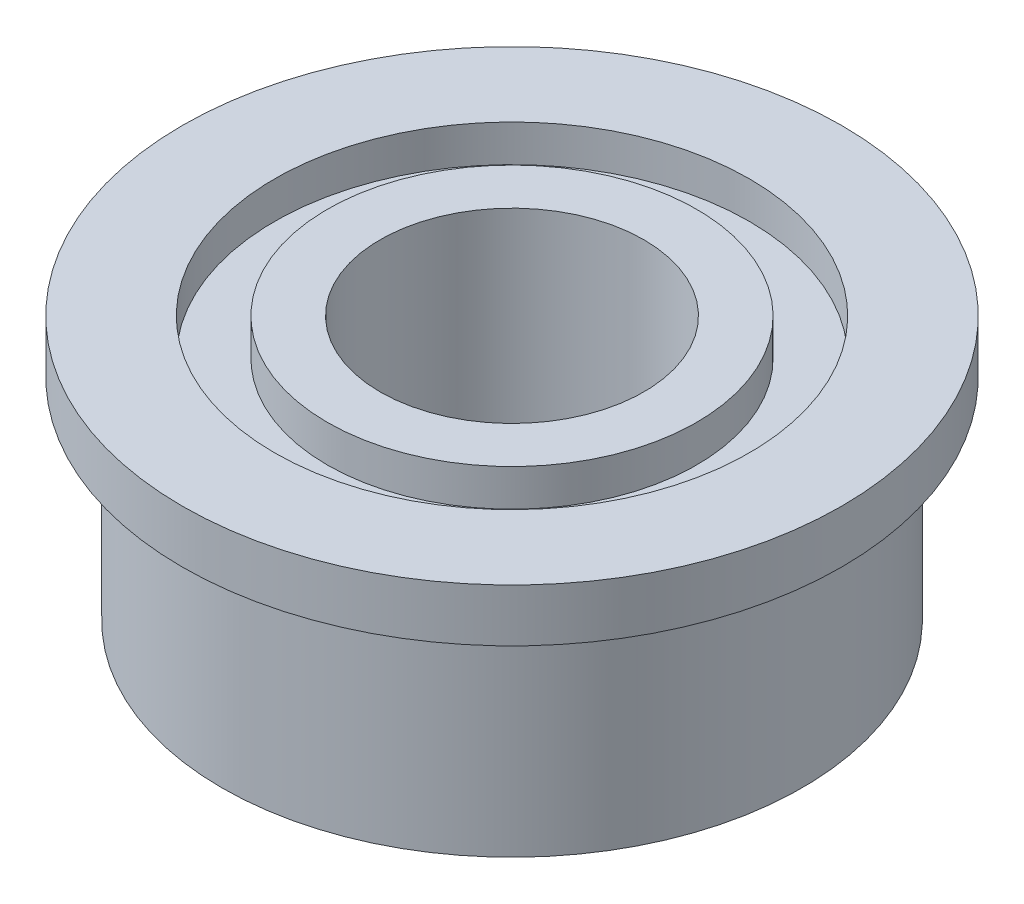
ISO-10303-21;
HEADER;
FILE_DESCRIPTION(('STEP AP214'),'2;1');
FILE_NAME('part.step','',(''),(''),'','','');
FILE_SCHEMA(('AUTOMOTIVE_DESIGN { 1 0 10303 214 1 1 1 1 }'));
ENDSEC;
DATA;
#1=APPLICATION_CONTEXT('core data for automotive mechanical design processes');
#2=APPLICATION_PROTOCOL_DEFINITION('international standard','automotive_design',2000,#1);
#3=PRODUCT_CONTEXT('',#1,'mechanical');
#4=PRODUCT('Part','Part','',(#3));
#5=PRODUCT_RELATED_PRODUCT_CATEGORY('part','',(#4));
#6=PRODUCT_DEFINITION_FORMATION('','',#4);
#7=PRODUCT_DEFINITION_CONTEXT('part definition',#1,'design');
#8=PRODUCT_DEFINITION('design','',#6,#7);
#9=PRODUCT_DEFINITION_SHAPE('','',#8);
#10=(LENGTH_UNIT() NAMED_UNIT(*) SI_UNIT(.MILLI.,.METRE.));
#11=(NAMED_UNIT(*) PLANE_ANGLE_UNIT() SI_UNIT($,.RADIAN.));
#12=(NAMED_UNIT(*) SI_UNIT($,.STERADIAN.) SOLID_ANGLE_UNIT());
#13=UNCERTAINTY_MEASURE_WITH_UNIT(LENGTH_MEASURE(1.E-05),#10,'distance_accuracy_value','');
#14=(GEOMETRIC_REPRESENTATION_CONTEXT(3) GLOBAL_UNCERTAINTY_ASSIGNED_CONTEXT((#13)) GLOBAL_UNIT_ASSIGNED_CONTEXT((#10,
#11,#12)) REPRESENTATION_CONTEXT('',''));
#15=CARTESIAN_POINT('',(0.,0.,0.));
#16=DIRECTION('',(0.,0.,1.));
#17=DIRECTION('',(1.,0.,0.));
#18=AXIS2_PLACEMENT_3D('',#15,#16,#17);
#19=CARTESIAN_POINT('',(0.,4.61129603751149,0.));
#20=DIRECTION('',(0.,1.,0.));
#21=DIRECTION('',(0.,0.,1.));
#22=AXIS2_PLACEMENT_3D('',#19,#20,#21);
#23=CYLINDRICAL_SURFACE('',#22,5.5);
#24=CARTESIAN_POINT('',(0.,0.,0.));
#25=DIRECTION('',(0.,1.,0.));
#26=DIRECTION('',(0.,0.,1.));
#27=AXIS2_PLACEMENT_3D('',#24,#25,#26);
#28=CIRCLE('',#27,5.5);
#29=CARTESIAN_POINT('',(0.,0.,5.5));
#30=VERTEX_POINT('',#29);
#31=EDGE_CURVE('E68',#30,#30,#28,.T.);
#32=ORIENTED_EDGE('',*,*,#31,.T.);
#33=EDGE_LOOP('',(#32));
#34=FACE_BOUND('',#33,.T.);
#35=CARTESIAN_POINT('',(0.,4.,0.));
#36=DIRECTION('',(0.,1.,0.));
#37=DIRECTION('',(0.,0.,1.));
#38=AXIS2_PLACEMENT_3D('',#35,#36,#37);
#39=CIRCLE('',#38,5.5);
#40=CARTESIAN_POINT('',(0.,4.,5.5));
#41=VERTEX_POINT('',#40);
#42=EDGE_CURVE('E10',#41,#41,#39,.T.);
#43=ORIENTED_EDGE('',*,*,#42,.F.);
#44=EDGE_LOOP('',(#43));
#45=FACE_BOUND('',#44,.T.);
#46=ADVANCED_FACE('F39',(#34,#45),#23,.T.);
#47=CARTESIAN_POINT('',(3.5,5.,0.));
#48=DIRECTION('',(0.,-1.,0.));
#49=DIRECTION('',(0.,0.,-1.));
#50=AXIS2_PLACEMENT_3D('',#47,#48,#49);
#51=PLANE('',#50);
#52=CARTESIAN_POINT('',(0.,5.,0.));
#53=DIRECTION('',(0.,1.,0.));
#54=DIRECTION('',(0.,0.,1.));
#55=AXIS2_PLACEMENT_3D('',#52,#53,#54);
#56=CIRCLE('',#55,2.5);
#57=CARTESIAN_POINT('',(0.,5.,2.5));
#58=VERTEX_POINT('',#57);
#59=EDGE_CURVE('E46',#58,#58,#56,.T.);
#60=ORIENTED_EDGE('',*,*,#59,.F.);
#61=EDGE_LOOP('',(#60));
#62=FACE_BOUND('',#61,.T.);
#63=CARTESIAN_POINT('',(0.,5.,0.));
#64=DIRECTION('',(0.,1.,0.));
#65=DIRECTION('',(0.,0.,1.));
#66=AXIS2_PLACEMENT_3D('',#63,#64,#65);
#67=CIRCLE('',#66,3.5);
#68=CARTESIAN_POINT('',(0.,5.,3.5));
#69=VERTEX_POINT('',#68);
#70=EDGE_CURVE('E80',#69,#69,#67,.T.);
#71=ORIENTED_EDGE('',*,*,#70,.T.);
#72=EDGE_LOOP('',(#71));
#73=FACE_BOUND('',#72,.T.);
#74=ADVANCED_FACE('F41',(#62,#73),#51,.F.);
#75=CARTESIAN_POINT('',(0.,4.61129603751149,0.));
#76=DIRECTION('',(0.,1.,0.));
#77=DIRECTION('',(0.,0.,1.));
#78=AXIS2_PLACEMENT_3D('',#75,#76,#77);
#79=CYLINDRICAL_SURFACE('',#78,2.5);
#80=CARTESIAN_POINT('',(0.,0.,0.));
#81=DIRECTION('',(0.,1.,0.));
#82=DIRECTION('',(0.,0.,1.));
#83=AXIS2_PLACEMENT_3D('',#80,#81,#82);
#84=CIRCLE('',#83,2.5);
#85=CARTESIAN_POINT('',(0.,0.,2.5));
#86=VERTEX_POINT('',#85);
#87=EDGE_CURVE('E50',#86,#86,#84,.T.);
#88=ORIENTED_EDGE('',*,*,#87,.F.);
#89=EDGE_LOOP('',(#88));
#90=FACE_BOUND('',#89,.T.);
#91=ORIENTED_EDGE('',*,*,#59,.T.);
#92=EDGE_LOOP('',(#91));
#93=FACE_BOUND('',#92,.T.);
#94=ADVANCED_FACE('F107',(#90,#93),#79,.F.);
#95=CARTESIAN_POINT('',(2.5,0.,0.));
#96=DIRECTION('',(0.,1.,0.));
#97=DIRECTION('',(0.,0.,1.));
#98=AXIS2_PLACEMENT_3D('',#95,#96,#97);
#99=PLANE('',#98);
#100=CARTESIAN_POINT('',(0.,0.,0.));
#101=DIRECTION('',(0.,1.,0.));
#102=DIRECTION('',(0.,0.,1.));
#103=AXIS2_PLACEMENT_3D('',#100,#101,#102);
#104=CIRCLE('',#103,3.5);
#105=CARTESIAN_POINT('',(0.,0.,3.5));
#106=VERTEX_POINT('',#105);
#107=EDGE_CURVE('E54',#106,#106,#104,.T.);
#108=ORIENTED_EDGE('',*,*,#107,.F.);
#109=EDGE_LOOP('',(#108));
#110=FACE_BOUND('',#109,.T.);
#111=ORIENTED_EDGE('',*,*,#87,.T.);
#112=EDGE_LOOP('',(#111));
#113=FACE_BOUND('',#112,.T.);
#114=ADVANCED_FACE('F129',(#110,#113),#99,.F.);
#115=CARTESIAN_POINT('',(0.,4.61129603751149,0.));
#116=DIRECTION('',(0.,1.,0.));
#117=DIRECTION('',(0.,0.,1.));
#118=AXIS2_PLACEMENT_3D('',#115,#116,#117);
#119=CYLINDRICAL_SURFACE('',#118,3.5);
#120=CARTESIAN_POINT('',(0.,0.7,0.));
#121=DIRECTION('',(0.,1.,0.));
#122=DIRECTION('',(0.,0.,1.));
#123=AXIS2_PLACEMENT_3D('',#120,#121,#122);
#124=CIRCLE('',#123,3.5);
#125=CARTESIAN_POINT('',(0.,0.7,3.5));
#126=VERTEX_POINT('',#125);
#127=EDGE_CURVE('E59',#126,#126,#124,.T.);
#128=ORIENTED_EDGE('',*,*,#127,.F.);
#129=EDGE_LOOP('',(#128));
#130=FACE_BOUND('',#129,.T.);
#131=ORIENTED_EDGE('',*,*,#107,.T.);
#132=EDGE_LOOP('',(#131));
#133=FACE_BOUND('',#132,.T.);
#134=ADVANCED_FACE('F125',(#130,#133),#119,.T.);
#135=CARTESIAN_POINT('',(3.5,0.7,0.));
#136=DIRECTION('',(0.,1.,0.));
#137=DIRECTION('',(0.,0.,1.));
#138=AXIS2_PLACEMENT_3D('',#135,#136,#137);
#139=PLANE('',#138);
#140=CARTESIAN_POINT('',(0.,0.7,0.));
#141=DIRECTION('',(0.,1.,0.));
#142=DIRECTION('',(0.,0.,1.));
#143=AXIS2_PLACEMENT_3D('',#140,#141,#142);
#144=CIRCLE('',#143,4.5);
#145=CARTESIAN_POINT('',(0.,0.7,4.5));
#146=VERTEX_POINT('',#145);
#147=EDGE_CURVE('E62',#146,#146,#144,.T.);
#148=ORIENTED_EDGE('',*,*,#147,.F.);
#149=EDGE_LOOP('',(#148));
#150=FACE_BOUND('',#149,.T.);
#151=ORIENTED_EDGE('',*,*,#127,.T.);
#152=EDGE_LOOP('',(#151));
#153=FACE_BOUND('',#152,.T.);
#154=ADVANCED_FACE('F121',(#150,#153),#139,.F.);
#155=CARTESIAN_POINT('',(0.,4.61129603751149,0.));
#156=DIRECTION('',(0.,1.,0.));
#157=DIRECTION('',(0.,0.,1.));
#158=AXIS2_PLACEMENT_3D('',#155,#156,#157);
#159=CYLINDRICAL_SURFACE('',#158,4.5);
#160=CARTESIAN_POINT('',(0.,0.,0.));
#161=DIRECTION('',(0.,1.,0.));
#162=DIRECTION('',(0.,0.,1.));
#163=AXIS2_PLACEMENT_3D('',#160,#161,#162);
#164=CIRCLE('',#163,4.5);
#165=CARTESIAN_POINT('',(0.,0.,4.5));
#166=VERTEX_POINT('',#165);
#167=EDGE_CURVE('E65',#166,#166,#164,.T.);
#168=ORIENTED_EDGE('',*,*,#167,.F.);
#169=EDGE_LOOP('',(#168));
#170=FACE_BOUND('',#169,.T.);
#171=ORIENTED_EDGE('',*,*,#147,.T.);
#172=EDGE_LOOP('',(#171));
#173=FACE_BOUND('',#172,.T.);
#174=ADVANCED_FACE('F117',(#170,#173),#159,.F.);
#175=CARTESIAN_POINT('',(4.5,0.,0.));
#176=DIRECTION('',(0.,1.,0.));
#177=DIRECTION('',(0.,0.,1.));
#178=AXIS2_PLACEMENT_3D('',#175,#176,#177);
#179=PLANE('',#178);
#180=ORIENTED_EDGE('',*,*,#31,.F.);
#181=EDGE_LOOP('',(#180));
#182=FACE_BOUND('',#181,.T.);
#183=ORIENTED_EDGE('',*,*,#167,.T.);
#184=EDGE_LOOP('',(#183));
#185=FACE_BOUND('',#184,.T.);
#186=ADVANCED_FACE('F114',(#182,#185),#179,.F.);
#187=CARTESIAN_POINT('',(5.5,5.,0.));
#188=DIRECTION('',(0.,-1.,0.));
#189=DIRECTION('',(0.,0.,-1.));
#190=AXIS2_PLACEMENT_3D('',#187,#188,#189);
#191=PLANE('',#190);
#192=CARTESIAN_POINT('',(0.,5.,0.));
#193=DIRECTION('',(0.,1.,0.));
#194=DIRECTION('',(0.,0.,1.));
#195=AXIS2_PLACEMENT_3D('',#192,#193,#194);
#196=CIRCLE('',#195,4.5);
#197=CARTESIAN_POINT('',(0.,5.,4.5));
#198=VERTEX_POINT('',#197);
#199=EDGE_CURVE('E71',#198,#198,#196,.T.);
#200=ORIENTED_EDGE('',*,*,#199,.F.);
#201=EDGE_LOOP('',(#200));
#202=FACE_BOUND('',#201,.T.);
#203=CARTESIAN_POINT('',(0.,5.,0.));
#204=DIRECTION('',(0.,1.,0.));
#205=DIRECTION('',(0.,0.,1.));
#206=AXIS2_PLACEMENT_3D('',#203,#204,#205);
#207=CIRCLE('',#206,6.25);
#208=CARTESIAN_POINT('',(0.,5.,6.25));
#209=VERTEX_POINT('',#208);
#210=EDGE_CURVE('E84',#209,#209,#207,.T.);
#211=ORIENTED_EDGE('',*,*,#210,.T.);
#212=EDGE_LOOP('',(#211));
#213=FACE_BOUND('',#212,.T.);
#214=ADVANCED_FACE('F112',(#202,#213),#191,.F.);
#215=CARTESIAN_POINT('',(0.,4.61129603751149,0.));
#216=DIRECTION('',(0.,1.,0.));
#217=DIRECTION('',(0.,0.,1.));
#218=AXIS2_PLACEMENT_3D('',#215,#216,#217);
#219=CYLINDRICAL_SURFACE('',#218,4.5);
#220=CARTESIAN_POINT('',(0.,4.3,0.));
#221=DIRECTION('',(0.,1.,0.));
#222=DIRECTION('',(0.,0.,1.));
#223=AXIS2_PLACEMENT_3D('',#220,#221,#222);
#224=CIRCLE('',#223,4.5);
#225=CARTESIAN_POINT('',(0.,4.3,4.5));
#226=VERTEX_POINT('',#225);
#227=EDGE_CURVE('E74',#226,#226,#224,.T.);
#228=ORIENTED_EDGE('',*,*,#227,.F.);
#229=EDGE_LOOP('',(#228));
#230=FACE_BOUND('',#229,.T.);
#231=ORIENTED_EDGE('',*,*,#199,.T.);
#232=EDGE_LOOP('',(#231));
#233=FACE_BOUND('',#232,.T.);
#234=ADVANCED_FACE('F169',(#230,#233),#219,.F.);
#235=CARTESIAN_POINT('',(4.5,4.3,0.));
#236=DIRECTION('',(0.,-1.,0.));
#237=DIRECTION('',(0.,0.,-1.));
#238=AXIS2_PLACEMENT_3D('',#235,#236,#237);
#239=PLANE('',#238);
#240=CARTESIAN_POINT('',(0.,4.3,0.));
#241=DIRECTION('',(0.,1.,0.));
#242=DIRECTION('',(0.,0.,1.));
#243=AXIS2_PLACEMENT_3D('',#240,#241,#242);
#244=CIRCLE('',#243,3.5);
#245=CARTESIAN_POINT('',(0.,4.3,3.5));
#246=VERTEX_POINT('',#245);
#247=EDGE_CURVE('E77',#246,#246,#244,.T.);
#248=ORIENTED_EDGE('',*,*,#247,.F.);
#249=EDGE_LOOP('',(#248));
#250=FACE_BOUND('',#249,.T.);
#251=ORIENTED_EDGE('',*,*,#227,.T.);
#252=EDGE_LOOP('',(#251));
#253=FACE_BOUND('',#252,.T.);
#254=ADVANCED_FACE('F176',(#250,#253),#239,.F.);
#255=CARTESIAN_POINT('',(0.,4.61129603751149,0.));
#256=DIRECTION('',(0.,1.,0.));
#257=DIRECTION('',(0.,0.,1.));
#258=AXIS2_PLACEMENT_3D('',#255,#256,#257);
#259=CYLINDRICAL_SURFACE('',#258,3.5);
#260=ORIENTED_EDGE('',*,*,#70,.F.);
#261=EDGE_LOOP('',(#260));
#262=FACE_BOUND('',#261,.T.);
#263=ORIENTED_EDGE('',*,*,#247,.T.);
#264=EDGE_LOOP('',(#263));
#265=FACE_BOUND('',#264,.T.);
#266=ADVANCED_FACE('F99',(#262,#265),#259,.T.);
#267=CARTESIAN_POINT('',(0.,4.,0.));
#268=DIRECTION('',(0.,1.,0.));
#269=DIRECTION('',(0.,0.,1.));
#270=AXIS2_PLACEMENT_3D('',#267,#268,#269);
#271=CYLINDRICAL_SURFACE('',#270,6.25);
#272=CARTESIAN_POINT('',(0.,4.,0.));
#273=DIRECTION('',(0.,1.,0.));
#274=DIRECTION('',(0.,0.,1.));
#275=AXIS2_PLACEMENT_3D('',#272,#273,#274);
#276=CIRCLE('',#275,6.25);
#277=CARTESIAN_POINT('',(0.,4.,6.25));
#278=VERTEX_POINT('',#277);
#279=EDGE_CURVE('E83',#278,#278,#276,.T.);
#280=ORIENTED_EDGE('',*,*,#279,.T.);
#281=EDGE_LOOP('',(#280));
#282=FACE_BOUND('',#281,.T.);
#283=ORIENTED_EDGE('',*,*,#210,.F.);
#284=EDGE_LOOP('',(#283));
#285=FACE_BOUND('',#284,.T.);
#286=ADVANCED_FACE('F90',(#282,#285),#271,.T.);
#287=CARTESIAN_POINT('',(0.,4.,0.));
#288=DIRECTION('',(0.,1.,0.));
#289=DIRECTION('',(0.,0.,1.));
#290=AXIS2_PLACEMENT_3D('',#287,#288,#289);
#291=PLANE('',#290);
#292=ORIENTED_EDGE('',*,*,#42,.T.);
#293=EDGE_LOOP('',(#292));
#294=FACE_BOUND('',#293,.T.);
#295=ORIENTED_EDGE('',*,*,#279,.F.);
#296=EDGE_LOOP('',(#295));
#297=FACE_BOUND('',#296,.T.);
#298=ADVANCED_FACE('F93',(#294,#297),#291,.F.);
#299=CLOSED_SHELL('',(#46,#74,#94,#114,#134,#154,#174,#186,#214,#234,#254,#266,#286,#298));
#300=MANIFOLD_SOLID_BREP('B2',#299);
#301=ADVANCED_BREP_SHAPE_REPRESENTATION('',(#18,#300),#14);
#302=SHAPE_DEFINITION_REPRESENTATION(#9,#301);
ENDSEC;
END-ISO-10303-21;
